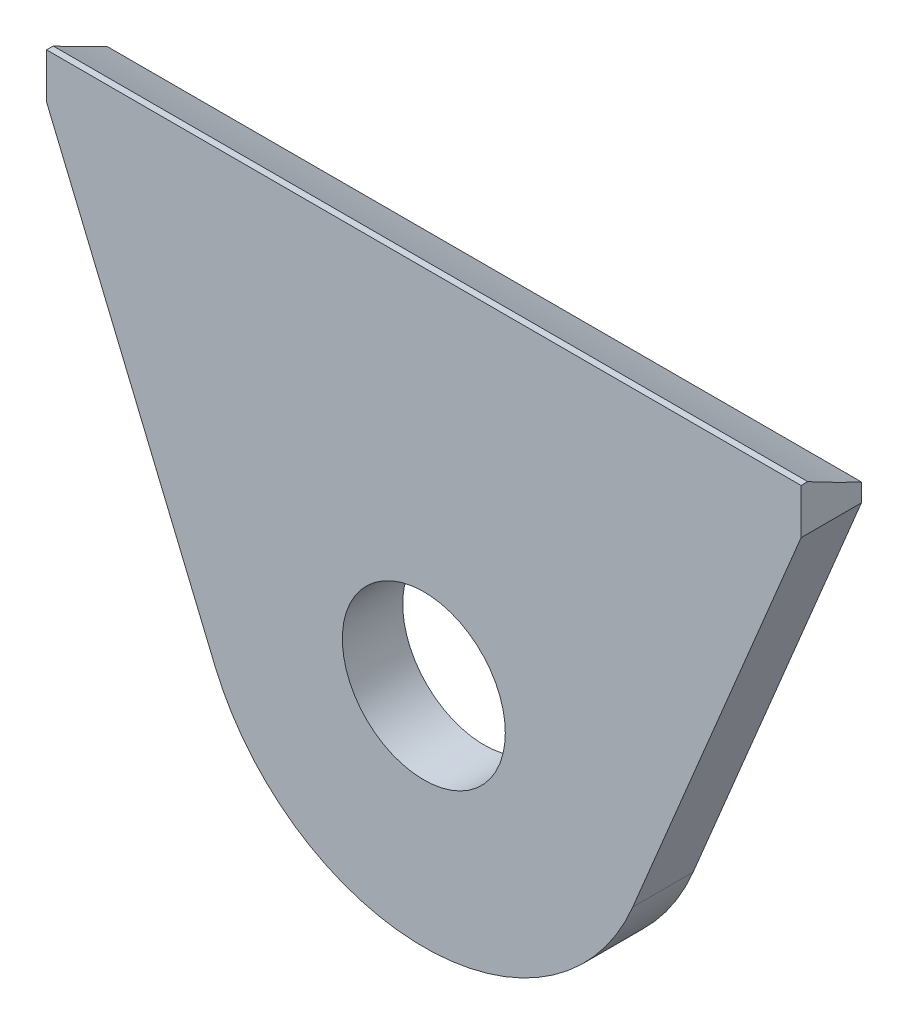
ISO-10303-21;
HEADER;
FILE_DESCRIPTION(('STEP AP214'),'2;1');
FILE_NAME('part.step','',(''),(''),'','','');
FILE_SCHEMA(('AUTOMOTIVE_DESIGN { 1 0 10303 214 1 1 1 1 }'));
ENDSEC;
DATA;
#1=APPLICATION_CONTEXT('core data for automotive mechanical design processes');
#2=APPLICATION_PROTOCOL_DEFINITION('international standard','automotive_design',2000,#1);
#3=PRODUCT_CONTEXT('',#1,'mechanical');
#4=PRODUCT('Part','Part','',(#3));
#5=PRODUCT_RELATED_PRODUCT_CATEGORY('part','',(#4));
#6=PRODUCT_DEFINITION_FORMATION('','',#4);
#7=PRODUCT_DEFINITION_CONTEXT('part definition',#1,'design');
#8=PRODUCT_DEFINITION('design','',#6,#7);
#9=PRODUCT_DEFINITION_SHAPE('','',#8);
#10=(LENGTH_UNIT() NAMED_UNIT(*) SI_UNIT(.MILLI.,.METRE.));
#11=(NAMED_UNIT(*) PLANE_ANGLE_UNIT() SI_UNIT($,.RADIAN.));
#12=(NAMED_UNIT(*) SI_UNIT($,.STERADIAN.) SOLID_ANGLE_UNIT());
#13=UNCERTAINTY_MEASURE_WITH_UNIT(LENGTH_MEASURE(1.E-05),#10,'distance_accuracy_value','');
#14=(GEOMETRIC_REPRESENTATION_CONTEXT(3) GLOBAL_UNCERTAINTY_ASSIGNED_CONTEXT((#13)) GLOBAL_UNIT_ASSIGNED_CONTEXT((#10,
#11,#12)) REPRESENTATION_CONTEXT('',''));
#15=CARTESIAN_POINT('',(0.,0.,0.));
#16=DIRECTION('',(0.,0.,1.));
#17=DIRECTION('',(1.,0.,0.));
#18=AXIS2_PLACEMENT_3D('',#15,#16,#17);
#19=CARTESIAN_POINT('',(25.,24.,4.));
#20=DIRECTION('',(-1.,0.,0.));
#21=DIRECTION('',(0.,0.,1.));
#22=AXIS2_PLACEMENT_3D('',#19,#20,#21);
#23=PLANE('',#22);
#24=CARTESIAN_POINT('',(25.,86.,-30.));
#25=DIRECTION('',(1.,0.,0.));
#26=DIRECTION('',(0.,0.,-1.));
#27=AXIS2_PLACEMENT_3D('',#24,#25,#26);
#28=CIRCLE('',#27,70.5);
#29=CARTESIAN_POINT('',(25.,24.,3.5596483890997));
#30=VERTEX_POINT('',#29);
#31=CARTESIAN_POINT('',(25.,22.2014890455898,0.));
#32=VERTEX_POINT('',#31);
#33=EDGE_CURVE('E121',#30,#32,#28,.T.);
#34=ORIENTED_EDGE('',*,*,#33,.F.);
#35=DIRECTION('',(0.,0.,-1.));
#36=VECTOR('',#35,1.);
#37=CARTESIAN_POINT('',(25.,24.,4.));
#38=LINE('',#37,#36);
#39=CARTESIAN_POINT('',(25.,24.,4.));
#40=VERTEX_POINT('',#39);
#41=EDGE_CURVE('E120',#40,#30,#38,.T.);
#42=ORIENTED_EDGE('',*,*,#41,.F.);
#43=DIRECTION('',(0.,1.,0.));
#44=VECTOR('',#43,1.);
#45=CARTESIAN_POINT('',(25.,24.,4.));
#46=LINE('',#45,#44);
#47=CARTESIAN_POINT('',(25.,21.,4.));
#48=VERTEX_POINT('',#47);
#49=EDGE_CURVE('E104',#48,#40,#46,.T.);
#50=ORIENTED_EDGE('',*,*,#49,.F.);
#51=DIRECTION('',(0.,0.,-1.));
#52=VECTOR('',#51,1.);
#53=CARTESIAN_POINT('',(25.,21.,4.));
#54=LINE('',#53,#52);
#55=CARTESIAN_POINT('',(25.,21.,0.));
#56=VERTEX_POINT('',#55);
#57=EDGE_CURVE('E123',#48,#56,#54,.T.);
#58=ORIENTED_EDGE('',*,*,#57,.T.);
#59=DIRECTION('',(0.,1.,0.));
#60=VECTOR('',#59,1.);
#61=CARTESIAN_POINT('',(25.,24.,0.));
#62=LINE('',#61,#60);
#63=EDGE_CURVE('E141',#56,#32,#62,.T.);
#64=ORIENTED_EDGE('',*,*,#63,.T.);
#65=EDGE_LOOP('',(#34,#42,#50,#58,#64));
#66=FACE_BOUND('',#65,.T.);
#67=ADVANCED_FACE('F41',(#66),#23,.F.);
#68=CARTESIAN_POINT('',(0.,0.,4.));
#69=DIRECTION('',(0.,0.,1.));
#70=DIRECTION('',(1.,0.,0.));
#71=AXIS2_PLACEMENT_3D('',#68,#69,#70);
#72=PLANE('',#71);
#73=DIRECTION('',(0.384615384615385,-0.923076923076923,0.));
#74=VECTOR('',#73,1.);
#75=CARTESIAN_POINT('',(-25.,21.,4.));
#76=LINE('',#75,#74);
#77=CARTESIAN_POINT('',(-25.,21.,4.));
#78=VERTEX_POINT('',#77);
#79=CARTESIAN_POINT('',(-13.8461538461538,-5.76923076923077,4.));
#80=VERTEX_POINT('',#79);
#81=EDGE_CURVE('E142',#78,#80,#76,.T.);
#82=ORIENTED_EDGE('',*,*,#81,.T.);
#83=CARTESIAN_POINT('',(0.,0.,4.));
#84=DIRECTION('',(0.,0.,1.));
#85=DIRECTION('',(1.,0.,0.));
#86=AXIS2_PLACEMENT_3D('',#83,#84,#85);
#87=CIRCLE('',#86,15.);
#88=CARTESIAN_POINT('',(13.8461538461538,-5.76923076923077,4.));
#89=VERTEX_POINT('',#88);
#90=EDGE_CURVE('E93',#80,#89,#87,.T.);
#91=ORIENTED_EDGE('',*,*,#90,.T.);
#92=DIRECTION('',(0.384615384615385,0.923076923076923,0.));
#93=VECTOR('',#92,1.);
#94=CARTESIAN_POINT('',(25.,21.,4.));
#95=LINE('',#94,#93);
#96=EDGE_CURVE('E109',#89,#48,#95,.T.);
#97=ORIENTED_EDGE('',*,*,#96,.T.);
#98=ORIENTED_EDGE('',*,*,#49,.T.);
#99=DIRECTION('',(-1.,0.,0.));
#100=VECTOR('',#99,1.);
#101=CARTESIAN_POINT('',(-25.,24.,4.));
#102=LINE('',#101,#100);
#103=CARTESIAN_POINT('',(-25.,24.,4.));
#104=VERTEX_POINT('',#103);
#105=EDGE_CURVE('E107',#40,#104,#102,.T.);
#106=ORIENTED_EDGE('',*,*,#105,.T.);
#107=DIRECTION('',(0.,-1.,0.));
#108=VECTOR('',#107,1.);
#109=CARTESIAN_POINT('',(-25.,24.,4.));
#110=LINE('',#109,#108);
#111=EDGE_CURVE('E63',#104,#78,#110,.T.);
#112=ORIENTED_EDGE('',*,*,#111,.T.);
#113=EDGE_LOOP('',(#82,#91,#97,#98,#106,#112));
#114=FACE_BOUND('',#113,.T.);
#115=CARTESIAN_POINT('',(0.,0.,4.));
#116=DIRECTION('',(0.,0.,1.));
#117=DIRECTION('',(1.,0.,0.));
#118=AXIS2_PLACEMENT_3D('',#115,#116,#117);
#119=CIRCLE('',#118,5.4);
#120=CARTESIAN_POINT('',(5.4,0.,4.));
#121=VERTEX_POINT('',#120);
#122=EDGE_CURVE('E140',#121,#121,#119,.T.);
#123=ORIENTED_EDGE('',*,*,#122,.F.);
#124=EDGE_LOOP('',(#123));
#125=FACE_BOUND('',#124,.T.);
#126=ADVANCED_FACE('F105',(#114,#125),#72,.T.);
#127=CARTESIAN_POINT('',(0.,0.,0.));
#128=DIRECTION('',(0.,0.,1.));
#129=DIRECTION('',(1.,0.,0.));
#130=AXIS2_PLACEMENT_3D('',#127,#128,#129);
#131=PLANE('',#130);
#132=DIRECTION('',(0.,-1.,0.));
#133=VECTOR('',#132,1.);
#134=CARTESIAN_POINT('',(-25.,24.,0.));
#135=LINE('',#134,#133);
#136=CARTESIAN_POINT('',(-25.,22.2014890455898,0.));
#137=VERTEX_POINT('',#136);
#138=CARTESIAN_POINT('',(-25.,21.,0.));
#139=VERTEX_POINT('',#138);
#140=EDGE_CURVE('E83',#137,#139,#135,.T.);
#141=ORIENTED_EDGE('',*,*,#140,.F.);
#142=DIRECTION('',(1.,0.,0.));
#143=VECTOR('',#142,1.);
#144=CARTESIAN_POINT('',(-25.,22.2014890455898,0.));
#145=LINE('',#144,#143);
#146=EDGE_CURVE('E160',#137,#32,#145,.T.);
#147=ORIENTED_EDGE('',*,*,#146,.T.);
#148=ORIENTED_EDGE('',*,*,#63,.F.);
#149=DIRECTION('',(0.384615384615385,0.923076923076923,0.));
#150=VECTOR('',#149,1.);
#151=CARTESIAN_POINT('',(25.,21.,0.));
#152=LINE('',#151,#150);
#153=CARTESIAN_POINT('',(13.8461538461538,-5.76923076923077,0.));
#154=VERTEX_POINT('',#153);
#155=EDGE_CURVE('E136',#154,#56,#152,.T.);
#156=ORIENTED_EDGE('',*,*,#155,.F.);
#157=CARTESIAN_POINT('',(0.,0.,0.));
#158=DIRECTION('',(0.,0.,1.));
#159=DIRECTION('',(1.,0.,0.));
#160=AXIS2_PLACEMENT_3D('',#157,#158,#159);
#161=CIRCLE('',#160,15.);
#162=CARTESIAN_POINT('',(-13.8461538461538,-5.76923076923077,0.));
#163=VERTEX_POINT('',#162);
#164=EDGE_CURVE('E137',#163,#154,#161,.T.);
#165=ORIENTED_EDGE('',*,*,#164,.F.);
#166=DIRECTION('',(0.384615384615385,-0.923076923076923,0.));
#167=VECTOR('',#166,1.);
#168=CARTESIAN_POINT('',(-25.,21.,0.));
#169=LINE('',#168,#167);
#170=EDGE_CURVE('E134',#139,#163,#169,.T.);
#171=ORIENTED_EDGE('',*,*,#170,.F.);
#172=EDGE_LOOP('',(#141,#147,#148,#156,#165,#171));
#173=FACE_BOUND('',#172,.T.);
#174=CARTESIAN_POINT('',(0.,0.,0.));
#175=DIRECTION('',(0.,0.,1.));
#176=DIRECTION('',(1.,0.,0.));
#177=AXIS2_PLACEMENT_3D('',#174,#175,#176);
#178=CIRCLE('',#177,5.4);
#179=CARTESIAN_POINT('',(5.4,0.,0.));
#180=VERTEX_POINT('',#179);
#181=EDGE_CURVE('E165',#180,#180,#178,.T.);
#182=ORIENTED_EDGE('',*,*,#181,.T.);
#183=EDGE_LOOP('',(#182));
#184=FACE_BOUND('',#183,.T.);
#185=ADVANCED_FACE('F152',(#173,#184),#131,.F.);
#186=CARTESIAN_POINT('',(-25.,21.,4.));
#187=DIRECTION('',(0.923076923076923,0.384615384615385,0.));
#188=DIRECTION('',(-0.384615384615385,0.923076923076923,0.));
#189=AXIS2_PLACEMENT_3D('',#186,#187,#188);
#190=PLANE('',#189);
#191=ORIENTED_EDGE('',*,*,#170,.T.);
#192=DIRECTION('',(0.,0.,-1.));
#193=VECTOR('',#192,1.);
#194=CARTESIAN_POINT('',(-13.8461538461538,-5.76923076923077,4.));
#195=LINE('',#194,#193);
#196=EDGE_CURVE('E11',#80,#163,#195,.T.);
#197=ORIENTED_EDGE('',*,*,#196,.F.);
#198=ORIENTED_EDGE('',*,*,#81,.F.);
#199=DIRECTION('',(0.,0.,-1.));
#200=VECTOR('',#199,1.);
#201=CARTESIAN_POINT('',(-25.,21.,4.));
#202=LINE('',#201,#200);
#203=EDGE_CURVE('E128',#78,#139,#202,.T.);
#204=ORIENTED_EDGE('',*,*,#203,.T.);
#205=EDGE_LOOP('',(#191,#197,#198,#204));
#206=FACE_BOUND('',#205,.T.);
#207=ADVANCED_FACE('F43',(#206),#190,.F.);
#208=CARTESIAN_POINT('',(0.,0.,4.));
#209=DIRECTION('',(0.,0.,-1.));
#210=DIRECTION('',(-1.,0.,0.));
#211=AXIS2_PLACEMENT_3D('',#208,#209,#210);
#212=CYLINDRICAL_SURFACE('',#211,15.);
#213=ORIENTED_EDGE('',*,*,#164,.T.);
#214=DIRECTION('',(0.,0.,-1.));
#215=VECTOR('',#214,1.);
#216=CARTESIAN_POINT('',(13.8461538461538,-5.76923076923077,4.));
#217=LINE('',#216,#215);
#218=EDGE_CURVE('E47',#89,#154,#217,.T.);
#219=ORIENTED_EDGE('',*,*,#218,.F.);
#220=ORIENTED_EDGE('',*,*,#90,.F.);
#221=ORIENTED_EDGE('',*,*,#196,.T.);
#222=EDGE_LOOP('',(#213,#219,#220,#221));
#223=FACE_BOUND('',#222,.T.);
#224=ADVANCED_FACE('F198',(#223),#212,.T.);
#225=CARTESIAN_POINT('',(25.,21.,4.));
#226=DIRECTION('',(-0.923076923076923,0.384615384615385,0.));
#227=DIRECTION('',(-0.384615384615385,-0.923076923076923,0.));
#228=AXIS2_PLACEMENT_3D('',#225,#226,#227);
#229=PLANE('',#228);
#230=ORIENTED_EDGE('',*,*,#155,.T.);
#231=ORIENTED_EDGE('',*,*,#57,.F.);
#232=ORIENTED_EDGE('',*,*,#96,.F.);
#233=ORIENTED_EDGE('',*,*,#218,.T.);
#234=EDGE_LOOP('',(#230,#231,#232,#233));
#235=FACE_BOUND('',#234,.T.);
#236=ADVANCED_FACE('F148',(#235),#229,.F.);
#237=CARTESIAN_POINT('',(-25.,24.,4.));
#238=DIRECTION('',(0.,-1.,0.));
#239=DIRECTION('',(0.,0.,-1.));
#240=AXIS2_PLACEMENT_3D('',#237,#238,#239);
#241=PLANE('',#240);
#242=ORIENTED_EDGE('',*,*,#41,.T.);
#243=DIRECTION('',(1.,0.,0.));
#244=VECTOR('',#243,1.);
#245=CARTESIAN_POINT('',(-25.,24.,3.5596483890997));
#246=LINE('',#245,#244);
#247=CARTESIAN_POINT('',(-25.,24.,3.5596483890997));
#248=VERTEX_POINT('',#247);
#249=EDGE_CURVE('E159',#30,#248,#246,.F.);
#250=ORIENTED_EDGE('',*,*,#249,.T.);
#251=DIRECTION('',(0.,0.,-1.));
#252=VECTOR('',#251,1.);
#253=CARTESIAN_POINT('',(-25.,24.,4.));
#254=LINE('',#253,#252);
#255=EDGE_CURVE('E122',#104,#248,#254,.T.);
#256=ORIENTED_EDGE('',*,*,#255,.F.);
#257=ORIENTED_EDGE('',*,*,#105,.F.);
#258=EDGE_LOOP('',(#242,#250,#256,#257));
#259=FACE_BOUND('',#258,.T.);
#260=ADVANCED_FACE('F126',(#259),#241,.F.);
#261=CARTESIAN_POINT('',(-25.,24.,4.));
#262=DIRECTION('',(1.,0.,0.));
#263=DIRECTION('',(0.,0.,-1.));
#264=AXIS2_PLACEMENT_3D('',#261,#262,#263);
#265=PLANE('',#264);
#266=ORIENTED_EDGE('',*,*,#255,.T.);
#267=CARTESIAN_POINT('',(-25.,86.,-30.));
#268=DIRECTION('',(1.,0.,0.));
#269=DIRECTION('',(0.,0.,-1.));
#270=AXIS2_PLACEMENT_3D('',#267,#268,#269);
#271=CIRCLE('',#270,70.5);
#272=EDGE_CURVE('E57',#248,#137,#271,.T.);
#273=ORIENTED_EDGE('',*,*,#272,.T.);
#274=ORIENTED_EDGE('',*,*,#140,.T.);
#275=ORIENTED_EDGE('',*,*,#203,.F.);
#276=ORIENTED_EDGE('',*,*,#111,.F.);
#277=EDGE_LOOP('',(#266,#273,#274,#275,#276));
#278=FACE_BOUND('',#277,.T.);
#279=ADVANCED_FACE('F161',(#278),#265,.F.);
#280=CARTESIAN_POINT('',(0.,0.,4.));
#281=DIRECTION('',(0.,0.,-1.));
#282=DIRECTION('',(-1.,0.,0.));
#283=AXIS2_PLACEMENT_3D('',#280,#281,#282);
#284=CYLINDRICAL_SURFACE('',#283,5.4);
#285=ORIENTED_EDGE('',*,*,#122,.T.);
#286=EDGE_LOOP('',(#285));
#287=FACE_BOUND('',#286,.T.);
#288=ORIENTED_EDGE('',*,*,#181,.F.);
#289=EDGE_LOOP('',(#288));
#290=FACE_BOUND('',#289,.T.);
#291=ADVANCED_FACE('F180',(#287,#290),#284,.F.);
#292=CARTESIAN_POINT('',(-25.,86.,-30.));
#293=DIRECTION('',(1.,0.,0.));
#294=DIRECTION('',(0.,0.,-1.));
#295=AXIS2_PLACEMENT_3D('',#292,#293,#294);
#296=CYLINDRICAL_SURFACE('',#295,70.5);
#297=ORIENTED_EDGE('',*,*,#272,.F.);
#298=ORIENTED_EDGE('',*,*,#249,.F.);
#299=ORIENTED_EDGE('',*,*,#33,.T.);
#300=ORIENTED_EDGE('',*,*,#146,.F.);
#301=EDGE_LOOP('',(#297,#298,#299,#300));
#302=FACE_BOUND('',#301,.T.);
#303=ADVANCED_FACE('F162',(#302),#296,.F.);
#304=CLOSED_SHELL('',(#67,#126,#185,#207,#224,#236,#260,#279,#291,#303));
#305=MANIFOLD_SOLID_BREP('B2',#304);
#306=ADVANCED_BREP_SHAPE_REPRESENTATION('',(#18,#305),#14);
#307=SHAPE_DEFINITION_REPRESENTATION(#9,#306);
ENDSEC;
END-ISO-10303-21;
